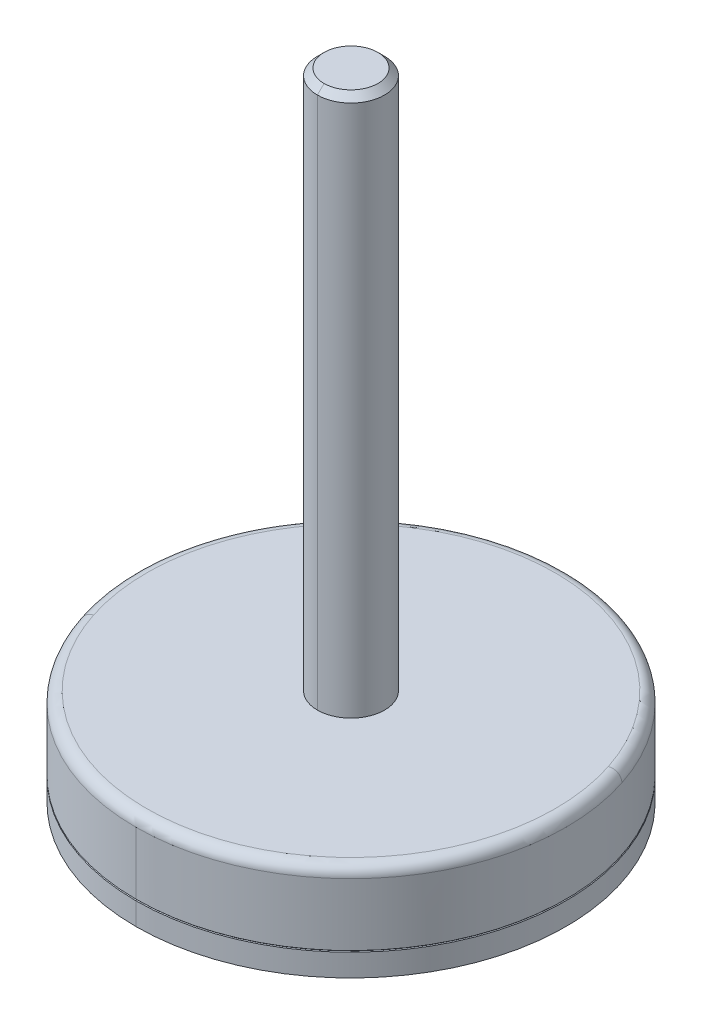
ISO-10303-21;
HEADER;
FILE_DESCRIPTION(('STEP AP214'),'2;1');
FILE_NAME('part.step','',(''),(''),'','','');
FILE_SCHEMA(('AUTOMOTIVE_DESIGN { 1 0 10303 214 1 1 1 1 }'));
ENDSEC;
DATA;
#1=APPLICATION_CONTEXT('core data for automotive mechanical design processes');
#2=APPLICATION_PROTOCOL_DEFINITION('international standard','automotive_design',2000,#1);
#3=PRODUCT_CONTEXT('',#1,'mechanical');
#4=PRODUCT('Part','Part','',(#3));
#5=PRODUCT_RELATED_PRODUCT_CATEGORY('part','',(#4));
#6=PRODUCT_DEFINITION_FORMATION('','',#4);
#7=PRODUCT_DEFINITION_CONTEXT('part definition',#1,'design');
#8=PRODUCT_DEFINITION('design','',#6,#7);
#9=PRODUCT_DEFINITION_SHAPE('','',#8);
#10=(LENGTH_UNIT() NAMED_UNIT(*) SI_UNIT(.MILLI.,.METRE.));
#11=(NAMED_UNIT(*) PLANE_ANGLE_UNIT() SI_UNIT($,.RADIAN.));
#12=(NAMED_UNIT(*) SI_UNIT($,.STERADIAN.) SOLID_ANGLE_UNIT());
#13=UNCERTAINTY_MEASURE_WITH_UNIT(LENGTH_MEASURE(1.E-05),#10,'distance_accuracy_value','');
#14=(GEOMETRIC_REPRESENTATION_CONTEXT(3) GLOBAL_UNCERTAINTY_ASSIGNED_CONTEXT((#13)) GLOBAL_UNIT_ASSIGNED_CONTEXT((#10,
#11,#12)) REPRESENTATION_CONTEXT('',''));
#15=CARTESIAN_POINT('',(0.,0.,0.));
#16=DIRECTION('',(0.,0.,1.));
#17=DIRECTION('',(1.,0.,0.));
#18=AXIS2_PLACEMENT_3D('',#15,#16,#17);
#19=CARTESIAN_POINT('',(0.,0.,0.));
#20=DIRECTION('',(0.,1.,0.));
#21=DIRECTION('',(0.,0.,1.));
#22=AXIS2_PLACEMENT_3D('',#19,#20,#21);
#23=PLANE('',#22);
#24=CARTESIAN_POINT('',(0.,0.,0.));
#25=DIRECTION('',(0.,1.,0.));
#26=DIRECTION('',(0.,0.,1.));
#27=AXIS2_PLACEMENT_3D('',#24,#25,#26);
#28=CIRCLE('',#27,30.480001016);
#29=CARTESIAN_POINT('',(0.,0.,-30.480001016));
#30=VERTEX_POINT('',#29);
#31=CARTESIAN_POINT('',(0.,0.,30.480001016));
#32=VERTEX_POINT('',#31);
#33=EDGE_CURVE('E11',#30,#32,#28,.T.);
#34=ORIENTED_EDGE('',*,*,#33,.F.);
#35=CARTESIAN_POINT('',(0.,0.,0.));
#36=DIRECTION('',(0.,1.,0.));
#37=DIRECTION('',(0.,0.,1.));
#38=AXIS2_PLACEMENT_3D('',#35,#36,#37);
#39=CIRCLE('',#38,30.480001016);
#40=EDGE_CURVE('E25',#32,#30,#39,.T.);
#41=ORIENTED_EDGE('',*,*,#40,.F.);
#42=EDGE_LOOP('',(#34,#41));
#43=FACE_BOUND('',#42,.T.);
#44=ADVANCED_FACE('F17',(#43),#23,.F.);
#45=CARTESIAN_POINT('',(0.,90.170002794,0.));
#46=DIRECTION('',(0.,1.,0.));
#47=DIRECTION('',(-1.,0.,0.));
#48=AXIS2_PLACEMENT_3D('',#45,#46,#47);
#49=CYLINDRICAL_SURFACE('',#48,30.480001016);
#50=DIRECTION('',(0.,1.,0.));
#51=VECTOR('',#50,1.);
#52=CARTESIAN_POINT('',(0.,0.,-30.480001016));
#53=LINE('',#52,#51);
#54=CARTESIAN_POINT('',(0.,3.16500002000001,-30.480001016));
#55=VERTEX_POINT('',#54);
#56=EDGE_CURVE('E273',#30,#55,#53,.T.);
#57=ORIENTED_EDGE('',*,*,#56,.T.);
#58=CARTESIAN_POINT('',(0.,3.16500002,0.));
#59=DIRECTION('',(0.,1.,0.));
#60=DIRECTION('',(0.,0.,1.));
#61=AXIS2_PLACEMENT_3D('',#58,#59,#60);
#62=CIRCLE('',#61,30.480001016);
#63=CARTESIAN_POINT('',(0.,3.16500002,30.480001016));
#64=VERTEX_POINT('',#63);
#65=EDGE_CURVE('E268',#64,#55,#62,.T.);
#66=ORIENTED_EDGE('',*,*,#65,.F.);
#67=DIRECTION('',(0.,1.,0.));
#68=VECTOR('',#67,1.);
#69=CARTESIAN_POINT('',(0.,0.,30.480001016));
#70=LINE('',#69,#68);
#71=EDGE_CURVE('E263',#32,#64,#70,.T.);
#72=ORIENTED_EDGE('',*,*,#71,.F.);
#73=ORIENTED_EDGE('',*,*,#40,.T.);
#74=EDGE_LOOP('',(#57,#66,#72,#73));
#75=FACE_BOUND('',#74,.T.);
#76=ADVANCED_FACE('F282',(#75),#49,.T.);
#77=CARTESIAN_POINT('',(0.,90.170002794,0.));
#78=DIRECTION('',(0.,1.,0.));
#79=DIRECTION('',(1.,0.,0.));
#80=AXIS2_PLACEMENT_3D('',#77,#78,#79);
#81=CYLINDRICAL_SURFACE('',#80,30.480001016);
#82=ORIENTED_EDGE('',*,*,#56,.F.);
#83=ORIENTED_EDGE('',*,*,#33,.T.);
#84=ORIENTED_EDGE('',*,*,#71,.T.);
#85=CARTESIAN_POINT('',(0.,3.16500002,0.));
#86=DIRECTION('',(0.,1.,0.));
#87=DIRECTION('',(0.,0.,1.));
#88=AXIS2_PLACEMENT_3D('',#85,#86,#87);
#89=CIRCLE('',#88,30.480001016);
#90=EDGE_CURVE('E258',#55,#64,#89,.T.);
#91=ORIENTED_EDGE('',*,*,#90,.F.);
#92=EDGE_LOOP('',(#82,#83,#84,#91));
#93=FACE_BOUND('',#92,.T.);
#94=ADVANCED_FACE('F285',(#93),#81,.T.);
#95=CARTESIAN_POINT('',(0.,3.16500002,0.));
#96=DIRECTION('',(0.,-1.,0.));
#97=DIRECTION('',(1.,0.,0.));
#98=AXIS2_PLACEMENT_3D('',#95,#96,#97);
#99=CONICAL_SURFACE('',#98,30.480001016,0.785398163397431);
#100=DIRECTION('',(0.,-0.70710678118656,0.707106781186535));
#101=VECTOR('',#100,1.);
#102=CARTESIAN_POINT('',(0.,3.26500007400001,30.380000962));
#103=LINE('',#102,#101);
#104=CARTESIAN_POINT('',(0.,3.265000074,30.380000962));
#105=VERTEX_POINT('',#104);
#106=EDGE_CURVE('E253',#105,#64,#103,.T.);
#107=ORIENTED_EDGE('',*,*,#106,.F.);
#108=CARTESIAN_POINT('',(0.,3.265000074,0.));
#109=DIRECTION('',(0.,1.,0.));
#110=DIRECTION('',(0.,0.,1.));
#111=AXIS2_PLACEMENT_3D('',#108,#109,#110);
#112=CIRCLE('',#111,30.380000962);
#113=CARTESIAN_POINT('',(0.,3.26500007400001,-30.380000962));
#114=VERTEX_POINT('',#113);
#115=EDGE_CURVE('E248',#114,#105,#112,.T.);
#116=ORIENTED_EDGE('',*,*,#115,.F.);
#117=DIRECTION('',(0.,-0.70710678118656,-0.707106781186535));
#118=VECTOR('',#117,1.);
#119=CARTESIAN_POINT('',(0.,3.26500007400001,-30.380000962));
#120=LINE('',#119,#118);
#121=EDGE_CURVE('E243',#114,#55,#120,.T.);
#122=ORIENTED_EDGE('',*,*,#121,.T.);
#123=ORIENTED_EDGE('',*,*,#90,.T.);
#124=EDGE_LOOP('',(#107,#116,#122,#123));
#125=FACE_BOUND('',#124,.T.);
#126=ADVANCED_FACE('F288',(#125),#99,.T.);
#127=CARTESIAN_POINT('',(0.,3.16500002,0.));
#128=DIRECTION('',(0.,-1.,0.));
#129=DIRECTION('',(-1.,0.,0.));
#130=AXIS2_PLACEMENT_3D('',#127,#128,#129);
#131=CONICAL_SURFACE('',#130,30.480001016,0.785398163397431);
#132=ORIENTED_EDGE('',*,*,#106,.T.);
#133=ORIENTED_EDGE('',*,*,#65,.T.);
#134=ORIENTED_EDGE('',*,*,#121,.F.);
#135=CARTESIAN_POINT('',(0.,3.265000074,0.));
#136=DIRECTION('',(0.,1.,0.));
#137=DIRECTION('',(0.,0.,1.));
#138=AXIS2_PLACEMENT_3D('',#135,#136,#137);
#139=CIRCLE('',#138,30.380000962);
#140=EDGE_CURVE('E238',#105,#114,#139,.T.);
#141=ORIENTED_EDGE('',*,*,#140,.F.);
#142=EDGE_LOOP('',(#132,#133,#134,#141));
#143=FACE_BOUND('',#142,.T.);
#144=ADVANCED_FACE('F291',(#143),#131,.T.);
#145=CARTESIAN_POINT('',(0.,3.265000074,0.));
#146=DIRECTION('',(0.,1.,0.));
#147=DIRECTION('',(-1.,0.,0.));
#148=AXIS2_PLACEMENT_3D('',#145,#146,#147);
#149=CONICAL_SURFACE('',#148,30.380000962,0.785398163397431);
#150=DIRECTION('',(0.,0.70710678118656,-0.707106781186535));
#151=VECTOR('',#150,1.);
#152=CARTESIAN_POINT('',(0.,3.265000074,-30.380000962));
#153=LINE('',#152,#151);
#154=CARTESIAN_POINT('',(0.,3.365000128,-30.480001016));
#155=VERTEX_POINT('',#154);
#156=EDGE_CURVE('E234',#114,#155,#153,.T.);
#157=ORIENTED_EDGE('',*,*,#156,.T.);
#158=CARTESIAN_POINT('',(0.,3.36500012800001,0.));
#159=DIRECTION('',(0.,1.,0.));
#160=DIRECTION('',(0.,0.,1.));
#161=AXIS2_PLACEMENT_3D('',#158,#159,#160);
#162=CIRCLE('',#161,30.480001016);
#163=CARTESIAN_POINT('',(0.,3.36500012800001,30.480001016));
#164=VERTEX_POINT('',#163);
#165=EDGE_CURVE('E229',#164,#155,#162,.T.);
#166=ORIENTED_EDGE('',*,*,#165,.F.);
#167=DIRECTION('',(0.,0.70710678118656,0.707106781186535));
#168=VECTOR('',#167,1.);
#169=CARTESIAN_POINT('',(0.,3.265000074,30.380000962));
#170=LINE('',#169,#168);
#171=EDGE_CURVE('E224',#105,#164,#170,.T.);
#172=ORIENTED_EDGE('',*,*,#171,.F.);
#173=ORIENTED_EDGE('',*,*,#140,.T.);
#174=EDGE_LOOP('',(#157,#166,#172,#173));
#175=FACE_BOUND('',#174,.T.);
#176=ADVANCED_FACE('F295',(#175),#149,.T.);
#177=CARTESIAN_POINT('',(0.,3.265000074,0.));
#178=DIRECTION('',(0.,1.,0.));
#179=DIRECTION('',(1.,0.,0.));
#180=AXIS2_PLACEMENT_3D('',#177,#178,#179);
#181=CONICAL_SURFACE('',#180,30.380000962,0.785398163397431);
#182=ORIENTED_EDGE('',*,*,#156,.F.);
#183=ORIENTED_EDGE('',*,*,#115,.T.);
#184=ORIENTED_EDGE('',*,*,#171,.T.);
#185=CARTESIAN_POINT('',(0.,3.36500012800001,0.));
#186=DIRECTION('',(0.,1.,0.));
#187=DIRECTION('',(0.,0.,1.));
#188=AXIS2_PLACEMENT_3D('',#185,#186,#187);
#189=CIRCLE('',#188,30.480001016);
#190=EDGE_CURVE('E219',#155,#164,#189,.T.);
#191=ORIENTED_EDGE('',*,*,#190,.F.);
#192=EDGE_LOOP('',(#182,#183,#184,#191));
#193=FACE_BOUND('',#192,.T.);
#194=ADVANCED_FACE('F298',(#193),#181,.T.);
#195=CARTESIAN_POINT('',(0.,90.170002794,0.));
#196=DIRECTION('',(0.,1.,0.));
#197=DIRECTION('',(1.,0.,0.));
#198=AXIS2_PLACEMENT_3D('',#195,#196,#197);
#199=CYLINDRICAL_SURFACE('',#198,30.480001016);
#200=DIRECTION('',(0.,1.,0.));
#201=VECTOR('',#200,1.);
#202=CARTESIAN_POINT('',(0.,3.36500012800001,-30.480001016));
#203=LINE('',#202,#201);
#204=CARTESIAN_POINT('',(0.,12.1919999121229,-30.480001016));
#205=VERTEX_POINT('',#204);
#206=EDGE_CURVE('E214',#155,#205,#203,.T.);
#207=ORIENTED_EDGE('',*,*,#206,.F.);
#208=ORIENTED_EDGE('',*,*,#190,.T.);
#209=DIRECTION('',(0.,1.,0.));
#210=VECTOR('',#209,1.);
#211=CARTESIAN_POINT('',(0.,3.36500012800001,30.480001016));
#212=LINE('',#211,#210);
#213=CARTESIAN_POINT('',(0.,12.1919999121229,30.480001016));
#214=VERTEX_POINT('',#213);
#215=EDGE_CURVE('E210',#164,#214,#212,.T.);
#216=ORIENTED_EDGE('',*,*,#215,.T.);
#217=CARTESIAN_POINT('',(0.,12.1919999121229,0.));
#218=DIRECTION('',(0.,1.,0.));
#219=DIRECTION('',(0.,0.,1.));
#220=AXIS2_PLACEMENT_3D('',#217,#218,#219);
#221=CIRCLE('',#220,30.480001016);
#222=CARTESIAN_POINT('',(-28.9882035829497,12.1919999121229,9.41883830250966));
#223=VERTEX_POINT('',#222);
#224=EDGE_CURVE('E205',#223,#214,#221,.T.);
#225=ORIENTED_EDGE('',*,*,#224,.F.);
#226=CARTESIAN_POINT('',(0.,12.1919999121229,0.));
#227=DIRECTION('',(0.,1.,0.));
#228=DIRECTION('',(0.,0.,1.));
#229=AXIS2_PLACEMENT_3D('',#226,#227,#228);
#230=CIRCLE('',#229,30.480001016);
#231=EDGE_CURVE('E200',#205,#223,#230,.T.);
#232=ORIENTED_EDGE('',*,*,#231,.F.);
#233=EDGE_LOOP('',(#207,#208,#216,#225,#232));
#234=FACE_BOUND('',#233,.T.);
#235=ADVANCED_FACE('F302',(#234),#199,.T.);
#236=CARTESIAN_POINT('',(0.,12.1919999121214,0.));
#237=DIRECTION('',(0.,1.,0.));
#238=DIRECTION('',(0.309016994374947,0.,0.951056516295154));
#239=AXIS2_PLACEMENT_3D('',#236,#237,#238);
#240=TOROIDAL_SURFACE('',#239,28.9560004201214,1.5240005958786);
#241=CARTESIAN_POINT('',(-27.5387928854017,12.1919999121214,8.94789621894562));
#242=DIRECTION('',(0.309016994374947,0.,0.951056516295154));
#243=DIRECTION('',(0.,1.,0.));
#244=AXIS2_PLACEMENT_3D('',#241,#242,#243);
#245=CIRCLE('',#244,1.5240005958786);
#246=CARTESIAN_POINT('',(-27.5387928854017,13.716000508,8.94789621894562));
#247=VERTEX_POINT('',#246);
#248=EDGE_CURVE('E196',#247,#223,#245,.T.);
#249=ORIENTED_EDGE('',*,*,#248,.F.);
#250=CARTESIAN_POINT('',(0.,13.716000508,0.));
#251=DIRECTION('',(0.,1.,0.));
#252=DIRECTION('',(0.,0.,1.));
#253=AXIS2_PLACEMENT_3D('',#250,#251,#252);
#254=CIRCLE('',#253,28.9560004201236);
#255=CARTESIAN_POINT('',(27.5387928854017,13.716000508,-8.94789621894563));
#256=VERTEX_POINT('',#255);
#257=EDGE_CURVE('E192',#256,#247,#254,.T.);
#258=ORIENTED_EDGE('',*,*,#257,.F.);
#259=CARTESIAN_POINT('',(27.5387928854017,12.1919999121214,-8.94789621894563));
#260=DIRECTION('',(-0.309016994374947,0.,-0.951056516295154));
#261=DIRECTION('',(0.,1.,0.));
#262=AXIS2_PLACEMENT_3D('',#259,#260,#261);
#263=CIRCLE('',#262,1.5240005958786);
#264=CARTESIAN_POINT('',(28.9882035829497,12.1919999121229,-9.41883830250966));
#265=VERTEX_POINT('',#264);
#266=EDGE_CURVE('E188',#256,#265,#263,.T.);
#267=ORIENTED_EDGE('',*,*,#266,.T.);
#268=CARTESIAN_POINT('',(0.,12.1919999121229,0.));
#269=DIRECTION('',(0.,1.,0.));
#270=DIRECTION('',(0.,0.,1.));
#271=AXIS2_PLACEMENT_3D('',#268,#269,#270);
#272=CIRCLE('',#271,30.480001016);
#273=EDGE_CURVE('E183',#265,#205,#272,.T.);
#274=ORIENTED_EDGE('',*,*,#273,.T.);
#275=ORIENTED_EDGE('',*,*,#231,.T.);
#276=EDGE_LOOP('',(#249,#258,#267,#274,#275));
#277=FACE_BOUND('',#276,.T.);
#278=ADVANCED_FACE('F307',(#277),#240,.T.);
#279=CARTESIAN_POINT('',(0.,90.170002794,0.));
#280=DIRECTION('',(0.,1.,0.));
#281=DIRECTION('',(-1.,0.,0.));
#282=AXIS2_PLACEMENT_3D('',#279,#280,#281);
#283=CYLINDRICAL_SURFACE('',#282,30.480001016);
#284=ORIENTED_EDGE('',*,*,#206,.T.);
#285=ORIENTED_EDGE('',*,*,#273,.F.);
#286=CARTESIAN_POINT('',(0.,12.1919999121229,0.));
#287=DIRECTION('',(0.,1.,0.));
#288=DIRECTION('',(0.,0.,1.));
#289=AXIS2_PLACEMENT_3D('',#286,#287,#288);
#290=CIRCLE('',#289,30.480001016);
#291=EDGE_CURVE('E180',#214,#265,#290,.T.);
#292=ORIENTED_EDGE('',*,*,#291,.F.);
#293=ORIENTED_EDGE('',*,*,#215,.F.);
#294=ORIENTED_EDGE('',*,*,#165,.T.);
#295=EDGE_LOOP('',(#284,#285,#292,#293,#294));
#296=FACE_BOUND('',#295,.T.);
#297=ADVANCED_FACE('F159',(#296),#283,.T.);
#298=CARTESIAN_POINT('',(0.,12.1919999121214,0.));
#299=DIRECTION('',(0.,1.,0.));
#300=DIRECTION('',(-0.309016994374947,0.,-0.951056516295154));
#301=AXIS2_PLACEMENT_3D('',#298,#299,#300);
#302=TOROIDAL_SURFACE('',#301,28.9560004201214,1.5240005958786);
#303=ORIENTED_EDGE('',*,*,#248,.T.);
#304=ORIENTED_EDGE('',*,*,#224,.T.);
#305=ORIENTED_EDGE('',*,*,#291,.T.);
#306=ORIENTED_EDGE('',*,*,#266,.F.);
#307=CARTESIAN_POINT('',(-27.5387928854038,13.716000508,8.9478962189463));
#308=CARTESIAN_POINT('',(-26.1332035467771,13.716000508,13.2736392146943));
#309=CARTESIAN_POINT('',(-23.878606386238,13.716000508,17.3236577242855));
#310=CARTESIAN_POINT('',(-20.8457113221237,13.716000508,20.8745302210937));
#311=CARTESIAN_POINT('',(-13.5511173295904,13.716000508,26.5955550856229));
#312=CARTESIAN_POINT('',(-4.63505042345728,13.716000508,29.1343007625854));
#313=CARTESIAN_POINT('',(0.0203791518245434,13.716000508,29.5006989548833));
#314=CARTESIAN_POINT('',(9.22380851305867,13.716000508,28.3879636106976));
#315=CARTESIAN_POINT('',(17.3235886978433,13.716000508,23.8785453653365));
#316=CARTESIAN_POINT('',(20.8745468864628,13.716000508,20.8457301536224));
#317=CARTESIAN_POINT('',(26.5955592682687,13.716000508,13.5511091206859));
#318=CARTESIAN_POINT('',(29.1342757319248,13.716000508,4.63504800976768));
#319=CARTESIAN_POINT('',(29.5007888945543,13.716000508,-0.0203591754457282));
#320=CARTESIAN_POINT('',(28.9442551614507,13.716000508,-4.62211193806349));
#321=CARTESIAN_POINT('',(27.5387928854038,13.716000508,-8.9478962189463));
#322=B_SPLINE_CURVE_WITH_KNOTS('',5,(#307,#308,#309,#310,#311,#312,#313,#314,#315,#316,#317,
#318,#319,#320,#321),.UNSPECIFIED.,.F.,.F.,(6,3,3,3,6),(0.,0.785398163397448,1.5707963267949,
2.35619449019234,3.14159265358979),.UNSPECIFIED.);
#323=EDGE_CURVE('E178',#247,#256,#322,.T.);
#324=ORIENTED_EDGE('',*,*,#323,.F.);
#325=EDGE_LOOP('',(#303,#304,#305,#306,#324));
#326=FACE_BOUND('',#325,.T.);
#327=ADVANCED_FACE('F153',(#326),#302,.T.);
#328=CARTESIAN_POINT('',(-28.9560004201236,13.716000508,0.));
#329=DIRECTION('',(0.,-1.,0.));
#330=DIRECTION('',(0.,0.,-1.));
#331=AXIS2_PLACEMENT_3D('',#328,#329,#330);
#332=PLANE('',#331);
#333=CARTESIAN_POINT('',(0.,13.716000508,0.));
#334=DIRECTION('',(0.,1.,0.));
#335=DIRECTION('',(0.,0.,1.));
#336=AXIS2_PLACEMENT_3D('',#333,#334,#335);
#337=CIRCLE('',#336,4.762500254);
#338=CARTESIAN_POINT('',(0.,13.716000508,-4.762500254));
#339=VERTEX_POINT('',#338);
#340=CARTESIAN_POINT('',(0.,13.716000508,4.762500254));
#341=VERTEX_POINT('',#340);
#342=EDGE_CURVE('E309',#339,#341,#337,.T.);
#343=ORIENTED_EDGE('',*,*,#342,.F.);
#344=CARTESIAN_POINT('',(0.,13.716000508,0.));
#345=DIRECTION('',(0.,1.,0.));
#346=DIRECTION('',(0.,0.,1.));
#347=AXIS2_PLACEMENT_3D('',#344,#345,#346);
#348=CIRCLE('',#347,4.762500254);
#349=EDGE_CURVE('E133',#341,#339,#348,.T.);
#350=ORIENTED_EDGE('',*,*,#349,.F.);
#351=EDGE_LOOP('',(#343,#350));
#352=FACE_BOUND('',#351,.T.);
#353=ORIENTED_EDGE('',*,*,#323,.T.);
#354=ORIENTED_EDGE('',*,*,#257,.T.);
#355=EDGE_LOOP('',(#353,#354));
#356=FACE_BOUND('',#355,.T.);
#357=ADVANCED_FACE('F142',(#352,#356),#332,.F.);
#358=CARTESIAN_POINT('',(0.,90.170002794,0.));
#359=DIRECTION('',(0.,1.,0.));
#360=DIRECTION('',(-1.,0.,2.38000569422679E-10));
#361=AXIS2_PLACEMENT_3D('',#358,#359,#360);
#362=CYLINDRICAL_SURFACE('',#361,4.762500254);
#363=DIRECTION('',(0.,1.,0.));
#364=VECTOR('',#363,1.);
#365=CARTESIAN_POINT('',(0.,13.716000508,-4.762500254));
#366=LINE('',#365,#364);
#367=CARTESIAN_POINT('',(0.,89.22385254,-4.762500254));
#368=VERTEX_POINT('',#367);
#369=EDGE_CURVE('E129',#339,#368,#366,.T.);
#370=ORIENTED_EDGE('',*,*,#369,.T.);
#371=CARTESIAN_POINT('',(0.,89.22385254,0.));
#372=DIRECTION('',(0.,1.,0.));
#373=DIRECTION('',(0.,0.,1.));
#374=AXIS2_PLACEMENT_3D('',#371,#372,#373);
#375=CIRCLE('',#374,4.762500254);
#376=CARTESIAN_POINT('',(0.,89.22385254,4.762500254));
#377=VERTEX_POINT('',#376);
#378=EDGE_CURVE('E107',#377,#368,#375,.T.);
#379=ORIENTED_EDGE('',*,*,#378,.F.);
#380=DIRECTION('',(0.,1.,0.));
#381=VECTOR('',#380,1.);
#382=CARTESIAN_POINT('',(0.,13.716000508,4.762500254));
#383=LINE('',#382,#381);
#384=EDGE_CURVE('E121',#341,#377,#383,.T.);
#385=ORIENTED_EDGE('',*,*,#384,.F.);
#386=ORIENTED_EDGE('',*,*,#349,.T.);
#387=EDGE_LOOP('',(#370,#379,#385,#386));
#388=FACE_BOUND('',#387,.T.);
#389=ADVANCED_FACE('F152',(#388),#362,.T.);
#390=CARTESIAN_POINT('',(0.,90.170002794,0.));
#391=DIRECTION('',(0.,1.,0.));
#392=DIRECTION('',(1.,0.,0.));
#393=AXIS2_PLACEMENT_3D('',#390,#391,#392);
#394=CYLINDRICAL_SURFACE('',#393,4.762500254);
#395=ORIENTED_EDGE('',*,*,#369,.F.);
#396=ORIENTED_EDGE('',*,*,#342,.T.);
#397=ORIENTED_EDGE('',*,*,#384,.T.);
#398=CARTESIAN_POINT('',(0.,89.22385254,0.));
#399=DIRECTION('',(0.,1.,0.));
#400=DIRECTION('',(0.,0.,1.));
#401=AXIS2_PLACEMENT_3D('',#398,#399,#400);
#402=CIRCLE('',#401,4.762500254);
#403=EDGE_CURVE('E117',#368,#377,#402,.T.);
#404=ORIENTED_EDGE('',*,*,#403,.F.);
#405=EDGE_LOOP('',(#395,#396,#397,#404));
#406=FACE_BOUND('',#405,.T.);
#407=ADVANCED_FACE('F319',(#406),#394,.T.);
#408=CARTESIAN_POINT('',(0.,89.22385254,0.));
#409=DIRECTION('',(0.,-1.,0.));
#410=DIRECTION('',(1.,0.,0.));
#411=AXIS2_PLACEMENT_3D('',#408,#409,#410);
#412=CONICAL_SURFACE('',#411,4.762500254,0.785398163397444);
#413=DIRECTION('',(0.,-0.70710678118655,0.707106781186545));
#414=VECTOR('',#413,1.);
#415=CARTESIAN_POINT('',(0.,90.170002794,3.81635));
#416=LINE('',#415,#414);
#417=CARTESIAN_POINT('',(0.,90.170002794,3.81635));
#418=VERTEX_POINT('',#417);
#419=EDGE_CURVE('E98',#418,#377,#416,.T.);
#420=ORIENTED_EDGE('',*,*,#419,.F.);
#421=CARTESIAN_POINT('',(0.,90.170002794,0.));
#422=DIRECTION('',(0.,1.,0.));
#423=DIRECTION('',(0.,0.,1.));
#424=AXIS2_PLACEMENT_3D('',#421,#422,#423);
#425=CIRCLE('',#424,3.81635);
#426=CARTESIAN_POINT('',(0.,90.170002794,-3.81635));
#427=VERTEX_POINT('',#426);
#428=EDGE_CURVE('E90',#427,#418,#425,.T.);
#429=ORIENTED_EDGE('',*,*,#428,.F.);
#430=DIRECTION('',(0.,-0.70710678118655,-0.707106781186545));
#431=VECTOR('',#430,1.);
#432=CARTESIAN_POINT('',(0.,90.170002794,-3.81635));
#433=LINE('',#432,#431);
#434=EDGE_CURVE('E95',#427,#368,#433,.T.);
#435=ORIENTED_EDGE('',*,*,#434,.T.);
#436=ORIENTED_EDGE('',*,*,#403,.T.);
#437=EDGE_LOOP('',(#420,#429,#435,#436));
#438=FACE_BOUND('',#437,.T.);
#439=ADVANCED_FACE('F92',(#438),#412,.T.);
#440=CARTESIAN_POINT('',(0.,89.22385254,0.));
#441=DIRECTION('',(0.,-1.,0.));
#442=DIRECTION('',(-1.,0.,0.));
#443=AXIS2_PLACEMENT_3D('',#440,#441,#442);
#444=CONICAL_SURFACE('',#443,4.762500254,0.785398163397444);
#445=ORIENTED_EDGE('',*,*,#419,.T.);
#446=ORIENTED_EDGE('',*,*,#378,.T.);
#447=ORIENTED_EDGE('',*,*,#434,.F.);
#448=CARTESIAN_POINT('',(0.,90.170002794,0.));
#449=DIRECTION('',(0.,1.,0.));
#450=DIRECTION('',(0.,0.,1.));
#451=AXIS2_PLACEMENT_3D('',#448,#449,#450);
#452=CIRCLE('',#451,3.81635);
#453=EDGE_CURVE('E102',#418,#427,#452,.T.);
#454=ORIENTED_EDGE('',*,*,#453,.F.);
#455=EDGE_LOOP('',(#445,#446,#447,#454));
#456=FACE_BOUND('',#455,.T.);
#457=ADVANCED_FACE('F106',(#456),#444,.T.);
#458=CARTESIAN_POINT('',(-3.81635,90.170002794,0.));
#459=DIRECTION('',(0.,-1.,0.));
#460=DIRECTION('',(0.,0.,-1.));
#461=AXIS2_PLACEMENT_3D('',#458,#459,#460);
#462=PLANE('',#461);
#463=ORIENTED_EDGE('',*,*,#453,.T.);
#464=ORIENTED_EDGE('',*,*,#428,.T.);
#465=EDGE_LOOP('',(#463,#464));
#466=FACE_BOUND('',#465,.T.);
#467=ADVANCED_FACE('F103',(#466),#462,.F.);
#468=CLOSED_SHELL('',(#44,#76,#94,#126,#144,#176,#194,#235,#278,#297,#327,#357,#389,#407,#439,
#457,#467));
#469=MANIFOLD_SOLID_BREP('B1',#468);
#470=ADVANCED_BREP_SHAPE_REPRESENTATION('',(#18,#469),#14);
#471=SHAPE_DEFINITION_REPRESENTATION(#9,#470);
ENDSEC;
END-ISO-10303-21;
